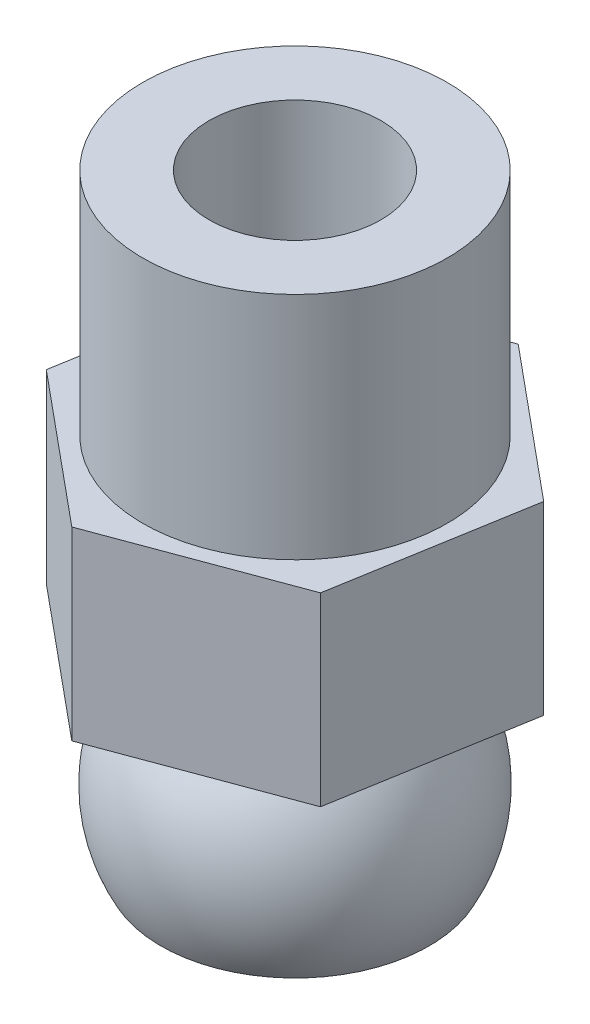
ISO-10303-21;
HEADER;
FILE_DESCRIPTION(('STEP AP214'),'2;1');
FILE_NAME('part.step','',(''),(''),'','','');
FILE_SCHEMA(('AUTOMOTIVE_DESIGN { 1 0 10303 214 1 1 1 1 }'));
ENDSEC;
DATA;
#1=APPLICATION_CONTEXT('core data for automotive mechanical design processes');
#2=APPLICATION_PROTOCOL_DEFINITION('international standard','automotive_design',2000,#1);
#3=PRODUCT_CONTEXT('',#1,'mechanical');
#4=PRODUCT('Part','Part','',(#3));
#5=PRODUCT_RELATED_PRODUCT_CATEGORY('part','',(#4));
#6=PRODUCT_DEFINITION_FORMATION('','',#4);
#7=PRODUCT_DEFINITION_CONTEXT('part definition',#1,'design');
#8=PRODUCT_DEFINITION('design','',#6,#7);
#9=PRODUCT_DEFINITION_SHAPE('','',#8);
#10=(LENGTH_UNIT() NAMED_UNIT(*) SI_UNIT(.MILLI.,.METRE.));
#11=(NAMED_UNIT(*) PLANE_ANGLE_UNIT() SI_UNIT($,.RADIAN.));
#12=(NAMED_UNIT(*) SI_UNIT($,.STERADIAN.) SOLID_ANGLE_UNIT());
#13=UNCERTAINTY_MEASURE_WITH_UNIT(LENGTH_MEASURE(1.E-05),#10,'distance_accuracy_value','');
#14=(GEOMETRIC_REPRESENTATION_CONTEXT(3) GLOBAL_UNCERTAINTY_ASSIGNED_CONTEXT((#13)) GLOBAL_UNIT_ASSIGNED_CONTEXT((#10,
#11,#12)) REPRESENTATION_CONTEXT('',''));
#15=CARTESIAN_POINT('',(0.,0.,0.));
#16=DIRECTION('',(0.,0.,1.));
#17=DIRECTION('',(1.,0.,0.));
#18=AXIS2_PLACEMENT_3D('',#15,#16,#17);
#19=CARTESIAN_POINT('',(3.92370670429727,-5.28375517777444,0.));
#20=DIRECTION('',(0.,1.,0.));
#21=DIRECTION('',(-1.,0.,0.));
#22=AXIS2_PLACEMENT_3D('',#19,#20,#21);
#23=PLANE('',#22);
#24=CARTESIAN_POINT('',(7.81370670429727,-5.28375517777444,0.));
#25=DIRECTION('',(0.,1.,0.));
#26=DIRECTION('',(-1.,0.,0.));
#27=AXIS2_PLACEMENT_3D('',#24,#25,#26);
#28=CIRCLE('',#27,6.12);
#29=CARTESIAN_POINT('',(1.69370670429727,-5.28375517777444,0.));
#30=VERTEX_POINT('',#29);
#31=EDGE_CURVE('E12',#30,#30,#28,.T.);
#32=ORIENTED_EDGE('',*,*,#31,.F.);
#33=EDGE_LOOP('',(#32));
#34=FACE_BOUND('',#33,.T.);
#35=DIRECTION('',(-0.167686985365992,0.,0.985840288758207));
#36=VECTOR('',#35,1.);
#37=CARTESIAN_POINT('',(0.686172494832996,-5.28375517777444,1.72304810131036));
#38=LINE('',#37,#36);
#39=CARTESIAN_POINT('',(1.82373500577116,-5.28375517777444,-4.96473957533084));
#40=VERTEX_POINT('',#39);
#41=CARTESIAN_POINT('',(0.519130259623744,-5.28375517777444,2.70509787120802));
#42=VERTEX_POINT('',#41);
#43=EDGE_CURVE('E111',#40,#42,#38,.T.);
#44=ORIENTED_EDGE('',*,*,#43,.T.);
#45=DIRECTION('',(0.769919241455798,0.,0.638141333590082));
#46=VECTOR('',#45,1.);
#47=CARTESIAN_POINT('',(-6.71566285207108,-5.28375517777444,-3.2914018601347));
#48=LINE('',#47,#46);
#49=CARTESIAN_POINT('',(6.50910195814985,-5.28375517777444,7.66983744653885));
#50=VERTEX_POINT('',#49);
#51=EDGE_CURVE('E106',#42,#50,#48,.T.);
#52=ORIENTED_EDGE('',*,*,#51,.T.);
#53=DIRECTION('',(0.93760622682179,0.,-0.347698955168125));
#54=VECTOR('',#53,1.);
#55=CARTESIAN_POINT('',(-5.01470275504702,-5.28375517777444,11.9432890765712));
#56=LINE('',#55,#54);
#57=CARTESIAN_POINT('',(13.8036784028234,-5.28375517777444,4.96473957533084));
#58=VERTEX_POINT('',#57);
#59=EDGE_CURVE('E150',#50,#58,#56,.T.);
#60=ORIENTED_EDGE('',*,*,#59,.T.);
#61=DIRECTION('',(0.167686985365992,0.,-0.985840288758208));
#62=VECTOR('',#61,1.);
#63=CARTESIAN_POINT('',(13.9707206380326,-5.28375517777444,3.98268980543317));
#64=LINE('',#63,#62);
#65=CARTESIAN_POINT('',(15.1082831489708,-5.28375517777444,-2.70509787120802));
#66=VERTEX_POINT('',#65);
#67=EDGE_CURVE('E63',#58,#66,#64,.T.);
#68=ORIENTED_EDGE('',*,*,#67,.T.);
#69=DIRECTION('',(-0.769919241455798,0.,-0.638141333590082));
#70=VECTOR('',#69,1.);
#71=CARTESIAN_POINT('',(1.88351833874985,-5.28375517777444,-13.6663371778816));
#72=LINE('',#71,#70);
#73=CARTESIAN_POINT('',(9.11831145044467,-5.28375517777444,-7.66983744653886));
#74=VERTEX_POINT('',#73);
#75=EDGE_CURVE('E140',#66,#74,#72,.T.);
#76=ORIENTED_EDGE('',*,*,#75,.T.);
#77=DIRECTION('',(-0.93760622682179,0.,0.347698955168125));
#78=VECTOR('',#77,1.);
#79=CARTESIAN_POINT('',(-9.70006970742571,-5.28375517777444,-0.691287945298492));
#80=LINE('',#79,#78);
#81=EDGE_CURVE('E132',#74,#40,#80,.T.);
#82=ORIENTED_EDGE('',*,*,#81,.T.);
#83=EDGE_LOOP('',(#44,#52,#60,#68,#76,#82));
#84=FACE_BOUND('',#83,.T.);
#85=ADVANCED_FACE('F48',(#34,#84),#23,.T.);
#86=CARTESIAN_POINT('',(3.92370670429727,-12.7337551777744,0.));
#87=DIRECTION('',(0.,1.,0.));
#88=DIRECTION('',(-1.,0.,0.));
#89=AXIS2_PLACEMENT_3D('',#86,#87,#88);
#90=PLANE('',#89);
#91=CARTESIAN_POINT('',(7.81370670429727,-12.7337551777744,0.));
#92=DIRECTION('',(0.,1.,0.));
#93=DIRECTION('',(-1.,0.,0.));
#94=AXIS2_PLACEMENT_3D('',#91,#92,#93);
#95=CIRCLE('',#94,4.34870670429727);
#96=CARTESIAN_POINT('',(3.465,-12.7337551777744,0.));
#97=VERTEX_POINT('',#96);
#98=EDGE_CURVE('E56',#97,#97,#95,.T.);
#99=ORIENTED_EDGE('',*,*,#98,.T.);
#100=EDGE_LOOP('',(#99));
#101=FACE_BOUND('',#100,.T.);
#102=DIRECTION('',(-0.769919241455798,0.,-0.638141333590082));
#103=VECTOR('',#102,1.);
#104=CARTESIAN_POINT('',(-6.71566285207108,-12.7337551777744,-3.2914018601347));
#105=LINE('',#104,#103);
#106=CARTESIAN_POINT('',(6.50910195814985,-12.7337551777744,7.66983744653885));
#107=VERTEX_POINT('',#106);
#108=CARTESIAN_POINT('',(0.519130259623746,-12.7337551777744,2.70509787120802));
#109=VERTEX_POINT('',#108);
#110=EDGE_CURVE('E103',#107,#109,#105,.T.);
#111=ORIENTED_EDGE('',*,*,#110,.T.);
#112=DIRECTION('',(0.167686985365992,0.,-0.985840288758207));
#113=VECTOR('',#112,1.);
#114=CARTESIAN_POINT('',(0.686172494832997,-12.7337551777744,1.72304810131036));
#115=LINE('',#114,#113);
#116=CARTESIAN_POINT('',(1.82373500577117,-12.7337551777744,-4.96473957533084));
#117=VERTEX_POINT('',#116);
#118=EDGE_CURVE('E118',#109,#117,#115,.T.);
#119=ORIENTED_EDGE('',*,*,#118,.T.);
#120=DIRECTION('',(0.93760622682179,0.,-0.347698955168125));
#121=VECTOR('',#120,1.);
#122=CARTESIAN_POINT('',(-9.7000697074257,-12.7337551777744,-0.691287945298492));
#123=LINE('',#122,#121);
#124=CARTESIAN_POINT('',(9.11831145044467,-12.7337551777744,-7.66983744653886));
#125=VERTEX_POINT('',#124);
#126=EDGE_CURVE('E110',#117,#125,#123,.T.);
#127=ORIENTED_EDGE('',*,*,#126,.T.);
#128=DIRECTION('',(0.769919241455798,0.,0.638141333590082));
#129=VECTOR('',#128,1.);
#130=CARTESIAN_POINT('',(1.88351833874985,-12.7337551777744,-13.6663371778816));
#131=LINE('',#130,#129);
#132=CARTESIAN_POINT('',(15.1082831489708,-12.7337551777744,-2.70509787120802));
#133=VERTEX_POINT('',#132);
#134=EDGE_CURVE('E131',#125,#133,#131,.T.);
#135=ORIENTED_EDGE('',*,*,#134,.T.);
#136=DIRECTION('',(-0.167686985365992,0.,0.985840288758207));
#137=VECTOR('',#136,1.);
#138=CARTESIAN_POINT('',(13.9707206380326,-12.7337551777744,3.98268980543317));
#139=LINE('',#138,#137);
#140=CARTESIAN_POINT('',(13.8036784028234,-12.7337551777744,4.96473957533084));
#141=VERTEX_POINT('',#140);
#142=EDGE_CURVE('E139',#133,#141,#139,.T.);
#143=ORIENTED_EDGE('',*,*,#142,.T.);
#144=DIRECTION('',(-0.93760622682179,0.,0.347698955168125));
#145=VECTOR('',#144,1.);
#146=CARTESIAN_POINT('',(-5.01470275504702,-12.7337551777744,11.9432890765712));
#147=LINE('',#146,#145);
#148=EDGE_CURVE('E121',#141,#107,#147,.T.);
#149=ORIENTED_EDGE('',*,*,#148,.T.);
#150=EDGE_LOOP('',(#111,#119,#127,#135,#143,#149));
#151=FACE_BOUND('',#150,.T.);
#152=ADVANCED_FACE('F116',(#101,#151),#90,.F.);
#153=CARTESIAN_POINT('',(7.81370670429727,3.95624482222556,0.));
#154=DIRECTION('',(0.,1.,0.));
#155=DIRECTION('',(-1.,0.,0.));
#156=AXIS2_PLACEMENT_3D('',#153,#154,#155);
#157=CYLINDRICAL_SURFACE('',#156,6.12);
#158=CARTESIAN_POINT('',(7.81370670429727,3.95624482222556,0.));
#159=DIRECTION('',(0.,1.,0.));
#160=DIRECTION('',(-1.,0.,0.));
#161=AXIS2_PLACEMENT_3D('',#158,#159,#160);
#162=CIRCLE('',#161,6.12);
#163=CARTESIAN_POINT('',(1.69370670429727,3.95624482222556,0.));
#164=VERTEX_POINT('',#163);
#165=EDGE_CURVE('E155',#164,#164,#162,.T.);
#166=ORIENTED_EDGE('',*,*,#165,.F.);
#167=EDGE_LOOP('',(#166));
#168=FACE_BOUND('',#167,.T.);
#169=ORIENTED_EDGE('',*,*,#31,.T.);
#170=EDGE_LOOP('',(#169));
#171=FACE_BOUND('',#170,.T.);
#172=ADVANCED_FACE('F50',(#168,#171),#157,.T.);
#173=CARTESIAN_POINT('',(7.81370670429727,3.95624482222556,0.));
#174=DIRECTION('',(0.,1.,0.));
#175=DIRECTION('',(-1.,0.,0.));
#176=AXIS2_PLACEMENT_3D('',#173,#174,#175);
#177=CYLINDRICAL_SURFACE('',#176,4.34870670429727);
#178=ORIENTED_EDGE('',*,*,#98,.F.);
#179=EDGE_LOOP('',(#178));
#180=FACE_BOUND('',#179,.T.);
#181=CARTESIAN_POINT('',(7.81370670429727,-13.06,0.));
#182=DIRECTION('',(0.,1.,0.));
#183=DIRECTION('',(-1.,0.,0.));
#184=AXIS2_PLACEMENT_3D('',#181,#182,#183);
#185=CIRCLE('',#184,4.34870670429727);
#186=CARTESIAN_POINT('',(3.465,-13.06,0.));
#187=VERTEX_POINT('',#186);
#188=EDGE_CURVE('E174',#187,#187,#185,.T.);
#189=ORIENTED_EDGE('',*,*,#188,.T.);
#190=EDGE_LOOP('',(#189));
#191=FACE_BOUND('',#190,.T.);
#192=ADVANCED_FACE('F180',(#180,#191),#177,.T.);
#193=CARTESIAN_POINT('',(7.81370670429727,-17.4087067042973,0.));
#194=DIRECTION('',(0.,1.,0.));
#195=DIRECTION('',(-1.,0.,0.));
#196=AXIS2_PLACEMENT_3D('',#193,#194,#195);
#197=SPHERICAL_SURFACE('',#196,6.15);
#198=CARTESIAN_POINT('',(7.81370670429727,-20.36,0.));
#199=DIRECTION('',(0.,1.,0.));
#200=DIRECTION('',(-1.,0.,0.));
#201=AXIS2_PLACEMENT_3D('',#198,#199,#200);
#202=CIRCLE('',#201,5.39558781623838);
#203=CARTESIAN_POINT('',(2.41811888805889,-20.36,0.));
#204=VERTEX_POINT('',#203);
#205=EDGE_CURVE('E171',#204,#204,#202,.T.);
#206=CARTESIAN_POINT('',(2.41811888805889,-20.36,0.));
#207=CARTESIAN_POINT('',(2.37858539678172,-20.2877264222879,0.));
#208=CARTESIAN_POINT('',(2.34050575801541,-20.2146576885072,0.));
#209=CARTESIAN_POINT('',(2.26731189352244,-20.0670497596736,0.));
#210=CARTESIAN_POINT('',(2.23219766779578,-19.9925105646206,0.));
#211=CARTESIAN_POINT('',(2.16499233740006,-19.8420815641071,0.));
#212=CARTESIAN_POINT('',(2.13290123273099,-19.7661917586466,0.));
#213=CARTESIAN_POINT('',(2.07179368832543,-19.6131842050831,0.));
#214=CARTESIAN_POINT('',(2.04277724858893,-19.5360664569801,0.));
#215=CARTESIAN_POINT('',(1.98786595726721,-19.3807274980969,0.));
#216=CARTESIAN_POINT('',(1.96197110568198,-19.3025062873166,0.));
#217=CARTESIAN_POINT('',(1.91334478158619,-19.145086710394,0.));
#218=CARTESIAN_POINT('',(1.89061330907563,-19.0658883442516,0.));
#219=CARTESIAN_POINT('',(1.84835045107331,-18.9066423294178,0.));
#220=CARTESIAN_POINT('',(1.82881906558154,-18.8265946807262,0.));
#221=CARTESIAN_POINT('',(1.79298791601776,-18.6657793481561,0.));
#222=CARTESIAN_POINT('',(1.77668815194573,-18.5850116642775,0.));
#223=CARTESIAN_POINT('',(1.74734656354838,-18.4228866704013,0.));
#224=CARTESIAN_POINT('',(1.73430473922306,-18.3415293604036,0.));
#225=CARTESIAN_POINT('',(1.71150008783109,-18.1783564756156,0.));
#226=CARTESIAN_POINT('',(1.70173726076445,-18.0965409008253,0.));
#227=CARTESIAN_POINT('',(1.68550636718901,-17.9325835876398,0.));
#228=CARTESIAN_POINT('',(1.67903830068021,-17.8504418492445,0.));
#229=CARTESIAN_POINT('',(1.66940737169366,-17.6859648366844,0.));
#230=CARTESIAN_POINT('',(1.66624450921592,-17.6036295625195,0.));
#231=CARTESIAN_POINT('',(1.66322909511975,-17.4388984187382,0.));
#232=CARTESIAN_POINT('',(1.66337654350133,-17.3565025491217,0.));
#233=CARTESIAN_POINT('',(1.66698151304994,-17.1917832525949,0.));
#234=CARTESIAN_POINT('',(1.67043903421697,-17.1094598256846,0.));
#235=CARTESIAN_POINT('',(1.68065856674797,-16.9450183357602,0.));
#236=CARTESIAN_POINT('',(1.68742057811195,-16.862900272746,0.));
#237=CARTESIAN_POINT('',(1.70423817294665,-16.699002100219,0.));
#238=CARTESIAN_POINT('',(1.71429375641737,-16.6172219907061,0.));
#239=CARTESIAN_POINT('',(1.73768225950248,-16.4541317691196,0.));
#240=CARTESIAN_POINT('',(1.75101517911686,-16.3728216570459,0.));
#241=CARTESIAN_POINT('',(1.78093682686818,-16.2108027154077,0.));
#242=CARTESIAN_POINT('',(1.79752555500511,-16.1300938858431,0.));
#243=CARTESIAN_POINT('',(1.83393203528144,-15.9694078234494,0.));
#244=CARTESIAN_POINT('',(1.85374978742083,-15.8894305906202,0.));
#245=CARTESIAN_POINT('',(1.89658231752966,-15.7303368546712,0.));
#246=CARTESIAN_POINT('',(1.91959709549909,-15.6512203515514,0.));
#247=CARTESIAN_POINT('',(1.96878651710892,-15.493975818243,0.));
#248=CARTESIAN_POINT('',(1.9949611607493,-15.4158477880544,0.));
#249=CARTESIAN_POINT('',(2.0504280515523,-15.2607063478184,0.));
#250=CARTESIAN_POINT('',(2.07972029871491,-15.1836929377711,0.));
#251=CARTESIAN_POINT('',(2.14137510067087,-15.0309050853447,0.));
#252=CARTESIAN_POINT('',(2.17373765546423,-14.9551306429657,0.));
#253=CARTESIAN_POINT('',(2.24148081937696,-14.8049430729133,0.));
#254=CARTESIAN_POINT('',(2.27686142849634,-14.73052994524,0.));
#255=CARTESIAN_POINT('',(2.35058357484484,-14.5831851537242,0.));
#256=CARTESIAN_POINT('',(2.38892511207395,-14.5102534898818,0.));
#257=CARTESIAN_POINT('',(2.46850720725738,-14.3659893827903,0.));
#258=CARTESIAN_POINT('',(2.50974776521169,-14.2946569395412,0.));
#259=CARTESIAN_POINT('',(2.59506131509292,-14.1537064496035,0.));
#260=CARTESIAN_POINT('',(2.63913430701984,-14.084088402915,0.));
#261=CARTESIAN_POINT('',(2.73004155935924,-13.9466791089584,0.));
#262=CARTESIAN_POINT('',(2.77687581977173,-13.8788878616903,0.));
#263=CARTESIAN_POINT('',(2.87323000543819,-13.7452416385259,0.));
#264=CARTESIAN_POINT('',(2.92274993069216,-13.6793866626296,0.));
#265=CARTESIAN_POINT('',(3.02439543050226,-13.5497192580936,0.));
#266=CARTESIAN_POINT('',(3.07652100505839,-13.4859068294538,0.));
#267=CARTESIAN_POINT('',(3.18329386279894,-13.3604277575772,0.));
#268=CARTESIAN_POINT('',(3.23794114598336,-13.2987611143404,0.));
#269=CARTESIAN_POINT('',(3.34966835625048,-13.1776724156939,0.));
#270=CARTESIAN_POINT('',(3.40674828333318,-13.1182503602842,0.));
#271=CARTESIAN_POINT('',(3.465,-13.06,0.));
#272=B_SPLINE_CURVE_WITH_KNOTS('',3,(#206,#207,#208,#209,#210,#211,#212,#213,#214,#215,#216,
#217,#218,#219,#220,#221,#222,#223,#224,#225,#226,#227,#228,#229,#230,#231,#232,#233,#234,#235,
#236,#237,#238,#239,#240,#241,#242,#243,#244,#245,#246,#247,#248,#249,#250,#251,#252,#253,#254,
#255,#256,#257,#258,#259,#260,#261,#262,#263,#264,#265,#266,#267,#268,#269,#270,#271),
.UNSPECIFIED.,.F.,.F.,(4,2,2,2,2,2,2,2,2,2,2,2,2,2,2,2,2,2,2,2,2,2,2,2,2,2,2,2,2,2,2,2,4),(0.,
0.247121485454677,0.494242970909352,0.741364456364027,0.988485941818703,1.23560742727338,
1.48272891272806,1.72985039818273,1.97697188363741,2.22409336909208,2.47121485454676,
2.71833634000144,2.96545782545611,3.21257931091079,3.45970079636546,3.70682228182014,
3.95394376727481,4.20106525272949,4.44818673818417,4.69530822363884,4.94242970909352,
5.18955119454819,5.43667268000287,5.68379416545754,5.93091565091222,6.1780371363669,
6.42515862182157,6.67228010727625,6.91940159273092,7.1665230781856,7.41364456364028,
7.66076604909495,7.90788753454963),.UNSPECIFIED.);
#273=EDGE_CURVE('BSEAM183',#204,#187,#272,.T.);
#274=ORIENTED_EDGE('',*,*,#205,.T.);
#275=ORIENTED_EDGE('',*,*,#188,.F.);
#276=ORIENTED_EDGE('',*,*,#273,.T.);
#277=ORIENTED_EDGE('',*,*,#273,.F.);
#278=EDGE_LOOP('',(#274,#276,#275,#277));
#279=FACE_BOUND('',#278,.T.);
#280=ADVANCED_FACE('F183',(#279),#197,.T.);
#281=CARTESIAN_POINT('',(3.92370670429727,-20.36,0.));
#282=DIRECTION('',(0.,-1.,0.));
#283=DIRECTION('',(1.,0.,0.));
#284=AXIS2_PLACEMENT_3D('',#281,#282,#283);
#285=PLANE('',#284);
#286=CARTESIAN_POINT('',(7.81370670429727,-20.36,0.));
#287=DIRECTION('',(0.,1.,0.));
#288=DIRECTION('',(-1.,0.,0.));
#289=AXIS2_PLACEMENT_3D('',#286,#287,#288);
#290=CIRCLE('',#289,3.45789347114127);
#291=CARTESIAN_POINT('',(4.355813233156,-20.36,0.));
#292=VERTEX_POINT('',#291);
#293=EDGE_CURVE('E168',#292,#292,#290,.T.);
#294=ORIENTED_EDGE('',*,*,#293,.T.);
#295=EDGE_LOOP('',(#294));
#296=FACE_BOUND('',#295,.T.);
#297=ORIENTED_EDGE('',*,*,#205,.F.);
#298=EDGE_LOOP('',(#297));
#299=FACE_BOUND('',#298,.T.);
#300=ADVANCED_FACE('F188',(#296,#299),#285,.T.);
#301=CARTESIAN_POINT('',(7.81370670429727,-19.5441953491553,0.));
#302=DIRECTION('',(0.,1.,0.));
#303=DIRECTION('',(-1.,0.,0.));
#304=AXIS2_PLACEMENT_3D('',#301,#302,#303);
#305=CONICAL_SURFACE('',#304,3.90412451744078,0.500523729527404);
#306=ORIENTED_EDGE('',*,*,#293,.F.);
#307=EDGE_LOOP('',(#306));
#308=FACE_BOUND('',#307,.T.);
#309=CARTESIAN_POINT('',(7.81370670429727,-19.5441953491553,0.));
#310=DIRECTION('',(0.,1.,0.));
#311=DIRECTION('',(-1.,0.,0.));
#312=AXIS2_PLACEMENT_3D('',#309,#310,#311);
#313=CIRCLE('',#312,3.90412451744078);
#314=CARTESIAN_POINT('',(3.90958218685649,-19.5441953491553,0.));
#315=VERTEX_POINT('',#314);
#316=EDGE_CURVE('E165',#315,#315,#313,.T.);
#317=ORIENTED_EDGE('',*,*,#316,.T.);
#318=EDGE_LOOP('',(#317));
#319=FACE_BOUND('',#318,.T.);
#320=ADVANCED_FACE('F194',(#308,#319),#305,.F.);
#321=CARTESIAN_POINT('',(7.81370670429727,-17.4087067042973,0.));
#322=DIRECTION('',(0.,1.,0.));
#323=DIRECTION('',(-1.,0.,0.));
#324=AXIS2_PLACEMENT_3D('',#321,#322,#323);
#325=SPHERICAL_SURFACE('',#324,4.45);
#326=CARTESIAN_POINT('',(7.81370670429727,-14.6077295993857,0.));
#327=DIRECTION('',(0.,1.,0.));
#328=DIRECTION('',(-1.,0.,0.));
#329=AXIS2_PLACEMENT_3D('',#326,#327,#328);
#330=CIRCLE('',#329,3.45789347114127);
#331=CARTESIAN_POINT('',(4.355813233156,-14.6077295993857,0.));
#332=VERTEX_POINT('',#331);
#333=EDGE_CURVE('E162',#332,#332,#330,.T.);
#334=CARTESIAN_POINT('',(3.90958218685649,-19.5441953491553,0.));
#335=CARTESIAN_POINT('',(3.88330306378018,-19.496152589028,0.));
#336=CARTESIAN_POINT('',(3.85791161157224,-19.4476243243232,0.));
#337=CARTESIAN_POINT('',(3.80893670713242,-19.3496638875317,0.));
#338=CARTESIAN_POINT('',(3.78535325490054,-19.300231715445,0.));
#339=CARTESIAN_POINT('',(3.74002700865214,-19.2005305656626,0.));
#340=CARTESIAN_POINT('',(3.71828421463563,-19.1502615879669,0.));
#341=CARTESIAN_POINT('',(3.67666877458916,-19.0489553991209,0.));
#342=CARTESIAN_POINT('',(3.6567961285592,-18.9979181879706,0.));
#343=CARTESIAN_POINT('',(3.61894810266637,-18.8951450628175,0.));
#344=CARTESIAN_POINT('',(3.6009727228035,-18.8434091488147,0.));
#345=CARTESIAN_POINT('',(3.56694371458974,-18.7393091243899,0.));
#346=CARTESIAN_POINT('',(3.55089008623886,-18.686945013968,0.));
#347=CARTESIAN_POINT('',(3.52072646029023,-18.5816599528429,0.));
#348=CARTESIAN_POINT('',(3.50661646269249,-18.5287390021398,0.));
#349=CARTESIAN_POINT('',(3.480359325469,-18.4224123771075,0.));
#350=CARTESIAN_POINT('',(3.46821218584324,-18.3690067027784,0.));
#351=CARTESIAN_POINT('',(3.44589731787387,-18.2617834072347,0.));
#352=CARTESIAN_POINT('',(3.43572958953025,-18.2079657860202,0.));
#353=CARTESIAN_POINT('',(3.41738739981294,-18.0999919349357,0.));
#354=CARTESIAN_POINT('',(3.40921293843925,-18.0458357050657,0.));
#355=CARTESIAN_POINT('',(3.39486842215566,-17.9372584362952,0.));
#356=CARTESIAN_POINT('',(3.38869836724576,-17.8828373973947,0.));
#357=CARTESIAN_POINT('',(3.37837107192669,-17.773804671057,0.));
#358=CARTESIAN_POINT('',(3.37421383151752,-17.7191929836198,0.));
#359=CARTESIAN_POINT('',(3.36791783034436,-17.6098533804999,0.));
#360=CARTESIAN_POINT('',(3.36577906958037,-17.5551254648172,0.));
#361=CARTESIAN_POINT('',(3.36352294222364,-17.4456279838847,0.));
#362=CARTESIAN_POINT('',(3.3634055756309,-17.3908584186349,0.));
#363=CARTESIAN_POINT('',(3.36519239655421,-17.2813522740028,0.));
#364=CARTESIAN_POINT('',(3.36709658407027,-17.2266156946205,0.));
#365=CARTESIAN_POINT('',(3.37292391834187,-17.1172501122077,0.));
#366=CARTESIAN_POINT('',(3.37684706509741,-17.0626211091772,0.));
#367=CARTESIAN_POINT('',(3.38670697170799,-16.9535451233562,0.));
#368=CARTESIAN_POINT('',(3.39264373156303,-16.8990981405657,0.));
#369=CARTESIAN_POINT('',(3.40652277424718,-16.7904603910705,0.));
#370=CARTESIAN_POINT('',(3.41446505707628,-16.7362696243659,0.));
#371=CARTESIAN_POINT('',(3.43234432262226,-16.6282181537385,0.));
#372=CARTESIAN_POINT('',(3.44228130533914,-16.5743574498158,0.));
#373=CARTESIAN_POINT('',(3.46413642936223,-16.4670395016657,0.));
#374=CARTESIAN_POINT('',(3.47605457066845,-16.4135822574384,0.));
#375=CARTESIAN_POINT('',(3.50185577081299,-16.3071440757915,0.));
#376=CARTESIAN_POINT('',(3.51573882965132,-16.254163138372,0.));
#377=CARTESIAN_POINT('',(3.54545094617456,-16.1487497683805,0.));
#378=CARTESIAN_POINT('',(3.56128000385948,-16.0963173358086,0.));
#379=CARTESIAN_POINT('',(3.59486254754831,-15.9920724260986,0.));
#380=CARTESIAN_POINT('',(3.61261603355221,-15.9402599489604,0.));
#381=CARTESIAN_POINT('',(3.65002324088392,-15.8373255558681,0.));
#382=CARTESIAN_POINT('',(3.66967696221173,-15.7862036399139,0.));
#383=CARTESIAN_POINT('',(3.71085785777112,-15.684720033944,0.));
#384=CARTESIAN_POINT('',(3.73238503200271,-15.6343583439282,0.));
#385=CARTESIAN_POINT('',(3.77728349774437,-15.5344638184528,0.));
#386=CARTESIAN_POINT('',(3.80065478925445,-15.484930982993,0.));
#387=CARTESIAN_POINT('',(3.84920964173259,-15.3867616663645,0.));
#388=CARTESIAN_POINT('',(3.87439320270065,-15.3381251851958,0.));
#389=CARTESIAN_POINT('',(3.92653827362048,-15.2418148531228,0.));
#390=CARTESIAN_POINT('',(3.95349978357226,-15.1941410022186,0.));
#391=CARTESIAN_POINT('',(4.00916402049923,-15.0998209033792,0.));
#392=CARTESIAN_POINT('',(4.03786674747442,-15.0531746554441,0.));
#393=CARTESIAN_POINT('',(4.09697427132088,-14.9609733031031,0.));
#394=CARTESIAN_POINT('',(4.12737906819214,-14.9154181986973,0.));
#395=CARTESIAN_POINT('',(4.18984942342928,-14.8254613057794,0.));
#396=CARTESIAN_POINT('',(4.22191498179517,-14.7810595172673,0.));
#397=CARTESIAN_POINT('',(4.28766269818809,-14.6934694137716,0.));
#398=CARTESIAN_POINT('',(4.32134485621512,-14.6502810987879,0.));
#399=CARTESIAN_POINT('',(4.355813233156,-14.6077295993857,0.));
#400=B_SPLINE_CURVE_WITH_KNOTS('',3,(#334,#335,#336,#337,#338,#339,#340,#341,#342,#343,#344,
#345,#346,#347,#348,#349,#350,#351,#352,#353,#354,#355,#356,#357,#358,#359,#360,#361,#362,#363,
#364,#365,#366,#367,#368,#369,#370,#371,#372,#373,#374,#375,#376,#377,#378,#379,#380,#381,#382,
#383,#384,#385,#386,#387,#388,#389,#390,#391,#392,#393,#394,#395,#396,#397,#398,#399),
.UNSPECIFIED.,.F.,.F.,(4,2,2,2,2,2,2,2,2,2,2,2,2,2,2,2,2,2,2,2,2,2,2,2,2,2,2,2,2,2,2,2,4),(0.,
0.164271755206155,0.328543510412307,0.492815265618462,0.657087020824614,0.82135877603077,
0.985630531236924,1.14990228644308,1.31417404164923,1.47844579685538,1.64271755206154,
1.80698930726769,1.97126106247385,2.13553281768,2.29980457288615,2.46407632809231,
2.62834808329846,2.79261983850461,2.95689159371077,3.12116334891692,3.28543510412308,
3.44970685932923,3.61397861453538,3.77825036974154,3.94252212494769,4.10679388015384,
4.27106563536,4.43533739056615,4.5996091457723,4.76388090097846,4.92815265618461,
5.09242441139076,5.25669616659692),.UNSPECIFIED.);
#401=EDGE_CURVE('BSEAM229',#315,#332,#400,.T.);
#402=ORIENTED_EDGE('',*,*,#316,.F.);
#403=ORIENTED_EDGE('',*,*,#333,.T.);
#404=ORIENTED_EDGE('',*,*,#401,.T.);
#405=ORIENTED_EDGE('',*,*,#401,.F.);
#406=EDGE_LOOP('',(#402,#404,#403,#405));
#407=FACE_BOUND('',#406,.T.);
#408=ADVANCED_FACE('F229',(#407),#325,.F.);
#409=CARTESIAN_POINT('',(7.81370670429727,3.95624482222556,0.));
#410=DIRECTION('',(0.,1.,0.));
#411=DIRECTION('',(-1.,0.,0.));
#412=AXIS2_PLACEMENT_3D('',#409,#410,#411);
#413=CYLINDRICAL_SURFACE('',#412,3.45789347114127);
#414=CARTESIAN_POINT('',(7.81370670429727,3.95624482222556,0.));
#415=DIRECTION('',(0.,1.,0.));
#416=DIRECTION('',(-1.,0.,0.));
#417=AXIS2_PLACEMENT_3D('',#414,#415,#416);
#418=CIRCLE('',#417,3.45789347114127);
#419=CARTESIAN_POINT('',(4.355813233156,3.95624482222556,0.));
#420=VERTEX_POINT('',#419);
#421=EDGE_CURVE('E159',#420,#420,#418,.T.);
#422=ORIENTED_EDGE('',*,*,#421,.T.);
#423=EDGE_LOOP('',(#422));
#424=FACE_BOUND('',#423,.T.);
#425=ORIENTED_EDGE('',*,*,#333,.F.);
#426=EDGE_LOOP('',(#425));
#427=FACE_BOUND('',#426,.T.);
#428=ADVANCED_FACE('F222',(#424,#427),#413,.F.);
#429=CARTESIAN_POINT('',(3.92370670429727,3.95624482222556,0.));
#430=DIRECTION('',(0.,-1.,0.));
#431=DIRECTION('',(1.,0.,0.));
#432=AXIS2_PLACEMENT_3D('',#429,#430,#431);
#433=PLANE('',#432);
#434=ORIENTED_EDGE('',*,*,#421,.F.);
#435=EDGE_LOOP('',(#434));
#436=FACE_BOUND('',#435,.T.);
#437=ORIENTED_EDGE('',*,*,#165,.T.);
#438=EDGE_LOOP('',(#437));
#439=FACE_BOUND('',#438,.T.);
#440=ADVANCED_FACE('F215',(#436,#439),#433,.F.);
#441=CARTESIAN_POINT('',(-5.01470275504702,-20.361,11.9432890765712));
#442=DIRECTION('',(0.347698955168125,0.,0.93760622682179));
#443=DIRECTION('',(0.93760622682179,0.,-0.347698955168125));
#444=AXIS2_PLACEMENT_3D('',#441,#442,#443);
#445=PLANE('',#444);
#446=DIRECTION('',(0.,1.,0.));
#447=VECTOR('',#446,1.);
#448=CARTESIAN_POINT('',(13.8036784028234,-20.361,4.96473957533084));
#449=LINE('',#448,#447);
#450=EDGE_CURVE('E67',#141,#58,#449,.T.);
#451=ORIENTED_EDGE('',*,*,#450,.T.);
#452=ORIENTED_EDGE('',*,*,#59,.F.);
#453=DIRECTION('',(0.,1.,0.));
#454=VECTOR('',#453,1.);
#455=CARTESIAN_POINT('',(6.50910195814985,-20.361,7.66983744653885));
#456=LINE('',#455,#454);
#457=EDGE_CURVE('E153',#107,#50,#456,.T.);
#458=ORIENTED_EDGE('',*,*,#457,.F.);
#459=ORIENTED_EDGE('',*,*,#148,.F.);
#460=EDGE_LOOP('',(#451,#452,#458,#459));
#461=FACE_BOUND('',#460,.T.);
#462=ADVANCED_FACE('F213',(#461),#445,.T.);
#463=CARTESIAN_POINT('',(13.9707206380326,-20.361,3.98268980543317));
#464=DIRECTION('',(0.985840288758207,0.,0.167686985365992));
#465=DIRECTION('',(0.167686985365992,0.,-0.985840288758207));
#466=AXIS2_PLACEMENT_3D('',#463,#464,#465);
#467=PLANE('',#466);
#468=DIRECTION('',(0.,1.,0.));
#469=VECTOR('',#468,1.);
#470=CARTESIAN_POINT('',(15.1082831489708,-20.361,-2.70509787120802));
#471=LINE('',#470,#469);
#472=EDGE_CURVE('E145',#133,#66,#471,.T.);
#473=ORIENTED_EDGE('',*,*,#472,.T.);
#474=ORIENTED_EDGE('',*,*,#67,.F.);
#475=ORIENTED_EDGE('',*,*,#450,.F.);
#476=ORIENTED_EDGE('',*,*,#142,.F.);
#477=EDGE_LOOP('',(#473,#474,#475,#476));
#478=FACE_BOUND('',#477,.T.);
#479=ADVANCED_FACE('F211',(#478),#467,.T.);
#480=CARTESIAN_POINT('',(1.88351833874985,-20.361,-13.6663371778816));
#481=DIRECTION('',(0.638141333590082,0.,-0.769919241455798));
#482=DIRECTION('',(-0.769919241455798,0.,-0.638141333590082));
#483=AXIS2_PLACEMENT_3D('',#480,#481,#482);
#484=PLANE('',#483);
#485=DIRECTION('',(0.,1.,0.));
#486=VECTOR('',#485,1.);
#487=CARTESIAN_POINT('',(9.11831145044467,-20.361,-7.66983744653886));
#488=LINE('',#487,#486);
#489=EDGE_CURVE('E136',#125,#74,#488,.T.);
#490=ORIENTED_EDGE('',*,*,#489,.T.);
#491=ORIENTED_EDGE('',*,*,#75,.F.);
#492=ORIENTED_EDGE('',*,*,#472,.F.);
#493=ORIENTED_EDGE('',*,*,#134,.F.);
#494=EDGE_LOOP('',(#490,#491,#492,#493));
#495=FACE_BOUND('',#494,.T.);
#496=ADVANCED_FACE('F210',(#495),#484,.T.);
#497=CARTESIAN_POINT('',(-9.7000697074257,-20.361,-0.691287945298492));
#498=DIRECTION('',(-0.347698955168125,0.,-0.93760622682179));
#499=DIRECTION('',(-0.93760622682179,0.,0.347698955168125));
#500=AXIS2_PLACEMENT_3D('',#497,#498,#499);
#501=PLANE('',#500);
#502=DIRECTION('',(0.,1.,0.));
#503=VECTOR('',#502,1.);
#504=CARTESIAN_POINT('',(1.82373500577117,-20.361,-4.96473957533084));
#505=LINE('',#504,#503);
#506=EDGE_CURVE('E125',#117,#40,#505,.T.);
#507=ORIENTED_EDGE('',*,*,#506,.T.);
#508=ORIENTED_EDGE('',*,*,#81,.F.);
#509=ORIENTED_EDGE('',*,*,#489,.F.);
#510=ORIENTED_EDGE('',*,*,#126,.F.);
#511=EDGE_LOOP('',(#507,#508,#509,#510));
#512=FACE_BOUND('',#511,.T.);
#513=ADVANCED_FACE('F207',(#512),#501,.T.);
#514=CARTESIAN_POINT('',(0.686172494832997,-20.361,1.72304810131036));
#515=DIRECTION('',(-0.985840288758208,0.,-0.167686985365992));
#516=DIRECTION('',(-0.167686985365992,0.,0.985840288758207));
#517=AXIS2_PLACEMENT_3D('',#514,#515,#516);
#518=PLANE('',#517);
#519=DIRECTION('',(0.,1.,0.));
#520=VECTOR('',#519,1.);
#521=CARTESIAN_POINT('',(0.519130259623745,-20.361,2.70509787120802));
#522=LINE('',#521,#520);
#523=EDGE_CURVE('E100',#109,#42,#522,.T.);
#524=ORIENTED_EDGE('',*,*,#523,.T.);
#525=ORIENTED_EDGE('',*,*,#43,.F.);
#526=ORIENTED_EDGE('',*,*,#506,.F.);
#527=ORIENTED_EDGE('',*,*,#118,.F.);
#528=EDGE_LOOP('',(#524,#525,#526,#527));
#529=FACE_BOUND('',#528,.T.);
#530=ADVANCED_FACE('F123',(#529),#518,.T.);
#531=CARTESIAN_POINT('',(-6.71566285207108,-20.361,-3.2914018601347));
#532=DIRECTION('',(-0.638141333590082,0.,0.769919241455798));
#533=DIRECTION('',(0.769919241455798,0.,0.638141333590082));
#534=AXIS2_PLACEMENT_3D('',#531,#532,#533);
#535=PLANE('',#534);
#536=ORIENTED_EDGE('',*,*,#457,.T.);
#537=ORIENTED_EDGE('',*,*,#51,.F.);
#538=ORIENTED_EDGE('',*,*,#523,.F.);
#539=ORIENTED_EDGE('',*,*,#110,.F.);
#540=EDGE_LOOP('',(#536,#537,#538,#539));
#541=FACE_BOUND('',#540,.T.);
#542=ADVANCED_FACE('F102',(#541),#535,.T.);
#543=CLOSED_SHELL('',(#85,#152,#172,#192,#280,#300,#320,#408,#428,#440,#462,#479,#496,#513,#530,#542));
#544=MANIFOLD_SOLID_BREP('B2',#543);
#545=ADVANCED_BREP_SHAPE_REPRESENTATION('',(#18,#544),#14);
#546=SHAPE_DEFINITION_REPRESENTATION(#9,#545);
ENDSEC;
END-ISO-10303-21;
